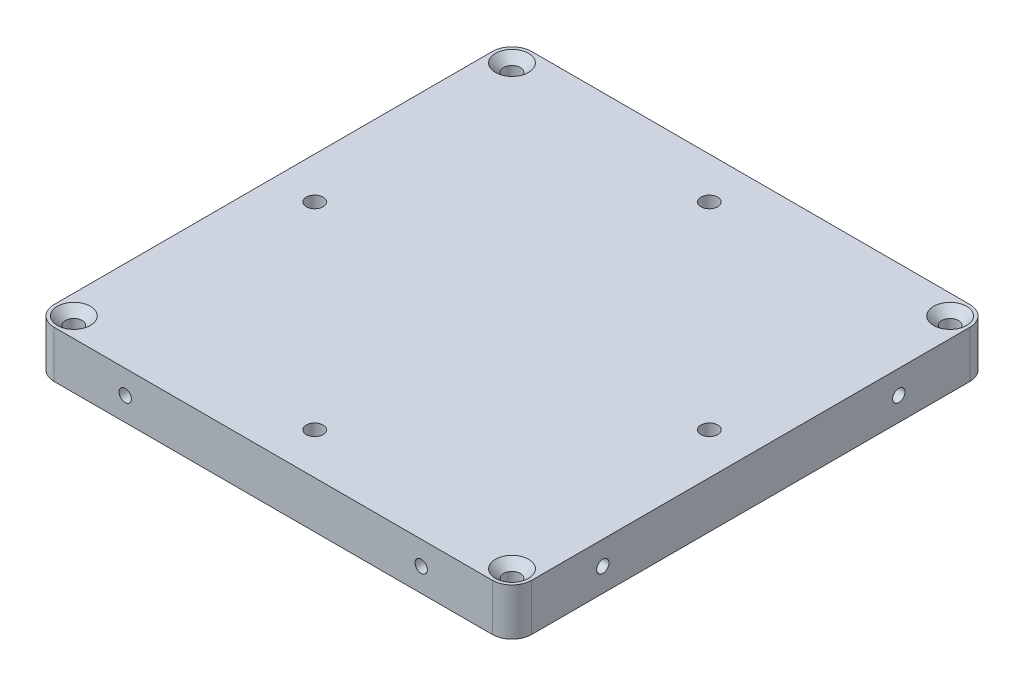
ISO-10303-21;
HEADER;
FILE_DESCRIPTION(('STEP AP214'),'2;1');
FILE_NAME('part.step','',(''),(''),'','','');
FILE_SCHEMA(('AUTOMOTIVE_DESIGN { 1 0 10303 214 1 1 1 1 }'));
ENDSEC;
DATA;
#1=APPLICATION_CONTEXT('core data for automotive mechanical design processes');
#2=APPLICATION_PROTOCOL_DEFINITION('international standard','automotive_design',2000,#1);
#3=PRODUCT_CONTEXT('',#1,'mechanical');
#4=PRODUCT('Part','Part','',(#3));
#5=PRODUCT_RELATED_PRODUCT_CATEGORY('part','',(#4));
#6=PRODUCT_DEFINITION_FORMATION('','',#4);
#7=PRODUCT_DEFINITION_CONTEXT('part definition',#1,'design');
#8=PRODUCT_DEFINITION('design','',#6,#7);
#9=PRODUCT_DEFINITION_SHAPE('','',#8);
#10=(LENGTH_UNIT() NAMED_UNIT(*) SI_UNIT(.MILLI.,.METRE.));
#11=(NAMED_UNIT(*) PLANE_ANGLE_UNIT() SI_UNIT($,.RADIAN.));
#12=(NAMED_UNIT(*) SI_UNIT($,.STERADIAN.) SOLID_ANGLE_UNIT());
#13=UNCERTAINTY_MEASURE_WITH_UNIT(LENGTH_MEASURE(1.E-05),#10,'distance_accuracy_value','');
#14=(GEOMETRIC_REPRESENTATION_CONTEXT(3) GLOBAL_UNCERTAINTY_ASSIGNED_CONTEXT((#13)) GLOBAL_UNIT_ASSIGNED_CONTEXT((#10,
#11,#12)) REPRESENTATION_CONTEXT('',''));
#15=CARTESIAN_POINT('',(0.,0.,0.));
#16=DIRECTION('',(0.,0.,1.));
#17=DIRECTION('',(1.,0.,0.));
#18=AXIS2_PLACEMENT_3D('',#15,#16,#17);
#19=CARTESIAN_POINT('',(-48.4125,4.7625,48.4125));
#20=DIRECTION('',(1.,0.,0.));
#21=DIRECTION('',(0.,0.,-1.));
#22=AXIS2_PLACEMENT_3D('',#19,#20,#21);
#23=PLANE('',#22);
#24=CARTESIAN_POINT('',(-48.4125,0.,-30.));
#25=DIRECTION('',(-1.,0.,0.));
#26=DIRECTION('',(0.,0.,1.));
#27=AXIS2_PLACEMENT_3D('',#24,#25,#26);
#28=CIRCLE('',#27,1.24999999999999);
#29=CARTESIAN_POINT('',(-48.4125,0.,-28.75));
#30=VERTEX_POINT('',#29);
#31=EDGE_CURVE('E177',#30,#30,#28,.T.);
#32=ORIENTED_EDGE('',*,*,#31,.F.);
#33=EDGE_LOOP('',(#32));
#34=FACE_BOUND('',#33,.T.);
#35=CARTESIAN_POINT('',(-48.4125,0.,30.));
#36=DIRECTION('',(-1.,0.,0.));
#37=DIRECTION('',(0.,0.,1.));
#38=AXIS2_PLACEMENT_3D('',#35,#36,#37);
#39=CIRCLE('',#38,1.24999999999999);
#40=CARTESIAN_POINT('',(-48.4125,0.,31.25));
#41=VERTEX_POINT('',#40);
#42=EDGE_CURVE('E185',#41,#41,#39,.T.);
#43=ORIENTED_EDGE('',*,*,#42,.F.);
#44=EDGE_LOOP('',(#43));
#45=FACE_BOUND('',#44,.T.);
#46=DIRECTION('',(0.,0.,1.));
#47=VECTOR('',#46,1.);
#48=CARTESIAN_POINT('',(-48.4125,4.7625,48.4125));
#49=LINE('',#48,#47);
#50=CARTESIAN_POINT('',(-48.4125,4.7625,-44.4125));
#51=VERTEX_POINT('',#50);
#52=CARTESIAN_POINT('',(-48.4125,4.7625,44.4125));
#53=VERTEX_POINT('',#52);
#54=EDGE_CURVE('E293',#51,#53,#49,.T.);
#55=ORIENTED_EDGE('',*,*,#54,.F.);
#56=DIRECTION('',(0.,-1.,0.));
#57=VECTOR('',#56,1.);
#58=CARTESIAN_POINT('',(-48.4125,4.7625,-44.4125));
#59=LINE('',#58,#57);
#60=CARTESIAN_POINT('',(-48.4125,-4.7625,-44.4125));
#61=VERTEX_POINT('',#60);
#62=EDGE_CURVE('E324',#51,#61,#59,.T.);
#63=ORIENTED_EDGE('',*,*,#62,.T.);
#64=DIRECTION('',(0.,0.,1.));
#65=VECTOR('',#64,1.);
#66=CARTESIAN_POINT('',(-48.4125,-4.7625,48.4125));
#67=LINE('',#66,#65);
#68=CARTESIAN_POINT('',(-48.4125,-4.7625,44.4125));
#69=VERTEX_POINT('',#68);
#70=EDGE_CURVE('E292',#61,#69,#67,.T.);
#71=ORIENTED_EDGE('',*,*,#70,.T.);
#72=DIRECTION('',(0.,-1.,0.));
#73=VECTOR('',#72,1.);
#74=CARTESIAN_POINT('',(-48.4125,4.7625,44.4125));
#75=LINE('',#74,#73);
#76=EDGE_CURVE('E308',#69,#53,#75,.F.);
#77=ORIENTED_EDGE('',*,*,#76,.T.);
#78=EDGE_LOOP('',(#55,#63,#71,#77));
#79=FACE_BOUND('',#78,.T.);
#80=ADVANCED_FACE('F45',(#34,#45,#79),#23,.F.);
#81=CARTESIAN_POINT('',(48.4125,4.7625,48.4125));
#82=DIRECTION('',(0.,0.,-1.));
#83=DIRECTION('',(-1.,0.,0.));
#84=AXIS2_PLACEMENT_3D('',#81,#82,#83);
#85=PLANE('',#84);
#86=CARTESIAN_POINT('',(-30.,0.,48.4125));
#87=DIRECTION('',(0.,0.,1.));
#88=DIRECTION('',(1.,0.,0.));
#89=AXIS2_PLACEMENT_3D('',#86,#87,#88);
#90=CIRCLE('',#89,1.24999999999999);
#91=CARTESIAN_POINT('',(-28.75,0.,48.4125));
#92=VERTEX_POINT('',#91);
#93=EDGE_CURVE('E193',#92,#92,#90,.T.);
#94=ORIENTED_EDGE('',*,*,#93,.F.);
#95=EDGE_LOOP('',(#94));
#96=FACE_BOUND('',#95,.T.);
#97=CARTESIAN_POINT('',(30.,0.,48.4125));
#98=DIRECTION('',(0.,0.,1.));
#99=DIRECTION('',(1.,0.,0.));
#100=AXIS2_PLACEMENT_3D('',#97,#98,#99);
#101=CIRCLE('',#100,1.24999999999999);
#102=CARTESIAN_POINT('',(31.25,0.,48.4125));
#103=VERTEX_POINT('',#102);
#104=EDGE_CURVE('E201',#103,#103,#101,.T.);
#105=ORIENTED_EDGE('',*,*,#104,.F.);
#106=EDGE_LOOP('',(#105));
#107=FACE_BOUND('',#106,.T.);
#108=DIRECTION('',(1.,0.,0.));
#109=VECTOR('',#108,1.);
#110=CARTESIAN_POINT('',(48.4125,-4.7625,48.4125));
#111=LINE('',#110,#109);
#112=CARTESIAN_POINT('',(-44.4125,-4.7625,48.4125));
#113=VERTEX_POINT('',#112);
#114=CARTESIAN_POINT('',(44.4125,-4.7625,48.4125));
#115=VERTEX_POINT('',#114);
#116=EDGE_CURVE('E312',#113,#115,#111,.T.);
#117=ORIENTED_EDGE('',*,*,#116,.T.);
#118=DIRECTION('',(0.,-1.,0.));
#119=VECTOR('',#118,1.);
#120=CARTESIAN_POINT('',(44.4125,4.7625,48.4125));
#121=LINE('',#120,#119);
#122=CARTESIAN_POINT('',(44.4125,4.7625,48.4125));
#123=VERTEX_POINT('',#122);
#124=EDGE_CURVE('E11',#115,#123,#121,.F.);
#125=ORIENTED_EDGE('',*,*,#124,.T.);
#126=DIRECTION('',(1.,0.,0.));
#127=VECTOR('',#126,1.);
#128=CARTESIAN_POINT('',(48.4125,4.7625,48.4125));
#129=LINE('',#128,#127);
#130=CARTESIAN_POINT('',(-44.4125,4.7625,48.4125));
#131=VERTEX_POINT('',#130);
#132=EDGE_CURVE('E297',#131,#123,#129,.T.);
#133=ORIENTED_EDGE('',*,*,#132,.F.);
#134=DIRECTION('',(0.,-1.,0.));
#135=VECTOR('',#134,1.);
#136=CARTESIAN_POINT('',(-44.4125,4.7625,48.4125));
#137=LINE('',#136,#135);
#138=EDGE_CURVE('E55',#131,#113,#137,.T.);
#139=ORIENTED_EDGE('',*,*,#138,.T.);
#140=EDGE_LOOP('',(#117,#125,#133,#139));
#141=FACE_BOUND('',#140,.T.);
#142=ADVANCED_FACE('F396',(#96,#107,#141),#85,.F.);
#143=CARTESIAN_POINT('',(48.4125,4.7625,48.4125));
#144=DIRECTION('',(-1.,0.,0.));
#145=DIRECTION('',(0.,0.,1.));
#146=AXIS2_PLACEMENT_3D('',#143,#144,#145);
#147=PLANE('',#146);
#148=CARTESIAN_POINT('',(48.4125,0.,30.));
#149=DIRECTION('',(1.,0.,0.));
#150=DIRECTION('',(0.,0.,-1.));
#151=AXIS2_PLACEMENT_3D('',#148,#149,#150);
#152=CIRCLE('',#151,1.24999999999999);
#153=CARTESIAN_POINT('',(48.4125,0.,28.75));
#154=VERTEX_POINT('',#153);
#155=EDGE_CURVE('E148',#154,#154,#152,.T.);
#156=ORIENTED_EDGE('',*,*,#155,.F.);
#157=EDGE_LOOP('',(#156));
#158=FACE_BOUND('',#157,.T.);
#159=CARTESIAN_POINT('',(48.4125,0.,-30.));
#160=DIRECTION('',(1.,0.,0.));
#161=DIRECTION('',(0.,0.,-1.));
#162=AXIS2_PLACEMENT_3D('',#159,#160,#161);
#163=CIRCLE('',#162,1.24999999999999);
#164=CARTESIAN_POINT('',(48.4125,0.,-31.25));
#165=VERTEX_POINT('',#164);
#166=EDGE_CURVE('E147',#165,#165,#163,.T.);
#167=ORIENTED_EDGE('',*,*,#166,.F.);
#168=EDGE_LOOP('',(#167));
#169=FACE_BOUND('',#168,.T.);
#170=DIRECTION('',(0.,0.,-1.));
#171=VECTOR('',#170,1.);
#172=CARTESIAN_POINT('',(48.4125,-4.7625,48.4125));
#173=LINE('',#172,#171);
#174=CARTESIAN_POINT('',(48.4125,-4.7625,44.4125));
#175=VERTEX_POINT('',#174);
#176=CARTESIAN_POINT('',(48.4125,-4.7625,-44.4125));
#177=VERTEX_POINT('',#176);
#178=EDGE_CURVE('E316',#175,#177,#173,.T.);
#179=ORIENTED_EDGE('',*,*,#178,.T.);
#180=DIRECTION('',(0.,-1.,0.));
#181=VECTOR('',#180,1.);
#182=CARTESIAN_POINT('',(48.4125,4.7625,-44.4125));
#183=LINE('',#182,#181);
#184=CARTESIAN_POINT('',(48.4125,4.7625,-44.4125));
#185=VERTEX_POINT('',#184);
#186=EDGE_CURVE('E63',#177,#185,#183,.F.);
#187=ORIENTED_EDGE('',*,*,#186,.T.);
#188=DIRECTION('',(0.,0.,-1.));
#189=VECTOR('',#188,1.);
#190=CARTESIAN_POINT('',(48.4125,4.7625,48.4125));
#191=LINE('',#190,#189);
#192=CARTESIAN_POINT('',(48.4125,4.7625,44.4125));
#193=VERTEX_POINT('',#192);
#194=EDGE_CURVE('E301',#193,#185,#191,.T.);
#195=ORIENTED_EDGE('',*,*,#194,.F.);
#196=DIRECTION('',(0.,-1.,0.));
#197=VECTOR('',#196,1.);
#198=CARTESIAN_POINT('',(48.4125,4.7625,44.4125));
#199=LINE('',#198,#197);
#200=EDGE_CURVE('E358',#193,#175,#199,.T.);
#201=ORIENTED_EDGE('',*,*,#200,.T.);
#202=EDGE_LOOP('',(#179,#187,#195,#201));
#203=FACE_BOUND('',#202,.T.);
#204=ADVANCED_FACE('F404',(#158,#169,#203),#147,.F.);
#205=CARTESIAN_POINT('',(48.4125,4.7625,-48.4125));
#206=DIRECTION('',(0.,0.,1.));
#207=DIRECTION('',(1.,0.,0.));
#208=AXIS2_PLACEMENT_3D('',#205,#206,#207);
#209=PLANE('',#208);
#210=CARTESIAN_POINT('',(30.,0.,-48.4125));
#211=DIRECTION('',(0.,0.,-1.));
#212=DIRECTION('',(-1.,0.,0.));
#213=AXIS2_PLACEMENT_3D('',#210,#211,#212);
#214=CIRCLE('',#213,1.24999999999999);
#215=CARTESIAN_POINT('',(28.75,0.,-48.4125));
#216=VERTEX_POINT('',#215);
#217=EDGE_CURVE('E161',#216,#216,#214,.T.);
#218=ORIENTED_EDGE('',*,*,#217,.F.);
#219=EDGE_LOOP('',(#218));
#220=FACE_BOUND('',#219,.T.);
#221=CARTESIAN_POINT('',(-30.,0.,-48.4125));
#222=DIRECTION('',(0.,0.,-1.));
#223=DIRECTION('',(-1.,0.,0.));
#224=AXIS2_PLACEMENT_3D('',#221,#222,#223);
#225=CIRCLE('',#224,1.24999999999999);
#226=CARTESIAN_POINT('',(-31.25,0.,-48.4125));
#227=VERTEX_POINT('',#226);
#228=EDGE_CURVE('E169',#227,#227,#225,.T.);
#229=ORIENTED_EDGE('',*,*,#228,.F.);
#230=EDGE_LOOP('',(#229));
#231=FACE_BOUND('',#230,.T.);
#232=DIRECTION('',(-1.,0.,0.));
#233=VECTOR('',#232,1.);
#234=CARTESIAN_POINT('',(48.4125,-4.7625,-48.4125));
#235=LINE('',#234,#233);
#236=CARTESIAN_POINT('',(44.4125,-4.7625,-48.4125));
#237=VERTEX_POINT('',#236);
#238=CARTESIAN_POINT('',(-44.4125,-4.7625,-48.4125));
#239=VERTEX_POINT('',#238);
#240=EDGE_CURVE('E298',#237,#239,#235,.T.);
#241=ORIENTED_EDGE('',*,*,#240,.T.);
#242=DIRECTION('',(0.,-1.,0.));
#243=VECTOR('',#242,1.);
#244=CARTESIAN_POINT('',(-44.4125,4.7625,-48.4125));
#245=LINE('',#244,#243);
#246=CARTESIAN_POINT('',(-44.4125,4.7625,-48.4125));
#247=VERTEX_POINT('',#246);
#248=EDGE_CURVE('E344',#239,#247,#245,.F.);
#249=ORIENTED_EDGE('',*,*,#248,.T.);
#250=DIRECTION('',(-1.,0.,0.));
#251=VECTOR('',#250,1.);
#252=CARTESIAN_POINT('',(48.4125,4.7625,-48.4125));
#253=LINE('',#252,#251);
#254=CARTESIAN_POINT('',(44.4125,4.7625,-48.4125));
#255=VERTEX_POINT('',#254);
#256=EDGE_CURVE('E304',#255,#247,#253,.T.);
#257=ORIENTED_EDGE('',*,*,#256,.F.);
#258=DIRECTION('',(0.,-1.,0.));
#259=VECTOR('',#258,1.);
#260=CARTESIAN_POINT('',(44.4125,4.7625,-48.4125));
#261=LINE('',#260,#259);
#262=EDGE_CURVE('E340',#255,#237,#261,.T.);
#263=ORIENTED_EDGE('',*,*,#262,.T.);
#264=EDGE_LOOP('',(#241,#249,#257,#263));
#265=FACE_BOUND('',#264,.T.);
#266=ADVANCED_FACE('F437',(#220,#231,#265),#209,.F.);
#267=CARTESIAN_POINT('',(0.,4.7625,0.));
#268=DIRECTION('',(0.,1.,0.));
#269=DIRECTION('',(0.,0.,1.));
#270=AXIS2_PLACEMENT_3D('',#267,#268,#269);
#271=PLANE('',#270);
#272=CARTESIAN_POINT('',(-44.4125,4.7625,-44.4125));
#273=DIRECTION('',(0.,1.,0.));
#274=DIRECTION('',(0.,0.,1.));
#275=AXIS2_PLACEMENT_3D('',#272,#273,#274);
#276=CIRCLE('',#275,3.36);
#277=CARTESIAN_POINT('',(-44.4125,4.7625,-41.0525));
#278=VERTEX_POINT('',#277);
#279=EDGE_CURVE('E209',#278,#278,#276,.T.);
#280=ORIENTED_EDGE('',*,*,#279,.F.);
#281=EDGE_LOOP('',(#280));
#282=FACE_BOUND('',#281,.T.);
#283=CARTESIAN_POINT('',(44.4125,4.7625,-44.4125));
#284=DIRECTION('',(0.,1.,0.));
#285=DIRECTION('',(0.,0.,1.));
#286=AXIS2_PLACEMENT_3D('',#283,#284,#285);
#287=CIRCLE('',#286,3.36);
#288=CARTESIAN_POINT('',(44.4125,4.7625,-41.0525));
#289=VERTEX_POINT('',#288);
#290=EDGE_CURVE('E217',#289,#289,#287,.T.);
#291=ORIENTED_EDGE('',*,*,#290,.F.);
#292=EDGE_LOOP('',(#291));
#293=FACE_BOUND('',#292,.T.);
#294=CARTESIAN_POINT('',(44.4125,4.7625,44.4125));
#295=DIRECTION('',(0.,1.,0.));
#296=DIRECTION('',(0.,0.,1.));
#297=AXIS2_PLACEMENT_3D('',#294,#295,#296);
#298=CIRCLE('',#297,3.36);
#299=CARTESIAN_POINT('',(44.4125,4.7625,47.7725));
#300=VERTEX_POINT('',#299);
#301=EDGE_CURVE('E226',#300,#300,#298,.T.);
#302=ORIENTED_EDGE('',*,*,#301,.F.);
#303=EDGE_LOOP('',(#302));
#304=FACE_BOUND('',#303,.T.);
#305=CARTESIAN_POINT('',(-44.4125,4.7625,44.4125));
#306=DIRECTION('',(0.,1.,0.));
#307=DIRECTION('',(0.,0.,1.));
#308=AXIS2_PLACEMENT_3D('',#305,#306,#307);
#309=CIRCLE('',#308,3.36);
#310=CARTESIAN_POINT('',(-44.4125,4.7625,47.7725));
#311=VERTEX_POINT('',#310);
#312=EDGE_CURVE('E235',#311,#311,#309,.T.);
#313=ORIENTED_EDGE('',*,*,#312,.F.);
#314=EDGE_LOOP('',(#313));
#315=FACE_BOUND('',#314,.T.);
#316=CARTESIAN_POINT('',(-40.,4.7625,0.));
#317=DIRECTION('',(0.,-1.,0.));
#318=DIRECTION('',(0.,0.,-1.));
#319=AXIS2_PLACEMENT_3D('',#316,#317,#318);
#320=CIRCLE('',#319,1.7);
#321=CARTESIAN_POINT('',(-40.,4.7625,-1.7));
#322=VERTEX_POINT('',#321);
#323=EDGE_CURVE('E252',#322,#322,#320,.T.);
#324=ORIENTED_EDGE('',*,*,#323,.T.);
#325=EDGE_LOOP('',(#324));
#326=FACE_BOUND('',#325,.T.);
#327=CARTESIAN_POINT('',(0.,4.7625,-40.));
#328=DIRECTION('',(0.,-1.,0.));
#329=DIRECTION('',(0.,0.,-1.));
#330=AXIS2_PLACEMENT_3D('',#327,#328,#329);
#331=CIRCLE('',#330,1.7);
#332=CARTESIAN_POINT('',(0.,4.7625,-41.7));
#333=VERTEX_POINT('',#332);
#334=EDGE_CURVE('E264',#333,#333,#331,.T.);
#335=ORIENTED_EDGE('',*,*,#334,.T.);
#336=EDGE_LOOP('',(#335));
#337=FACE_BOUND('',#336,.T.);
#338=CARTESIAN_POINT('',(40.,4.7625,0.));
#339=DIRECTION('',(0.,-1.,0.));
#340=DIRECTION('',(0.,0.,-1.));
#341=AXIS2_PLACEMENT_3D('',#338,#339,#340);
#342=CIRCLE('',#341,1.7);
#343=CARTESIAN_POINT('',(40.,4.7625,-1.7));
#344=VERTEX_POINT('',#343);
#345=EDGE_CURVE('E276',#344,#344,#342,.T.);
#346=ORIENTED_EDGE('',*,*,#345,.T.);
#347=EDGE_LOOP('',(#346));
#348=FACE_BOUND('',#347,.T.);
#349=CARTESIAN_POINT('',(0.,4.7625,40.));
#350=DIRECTION('',(0.,-1.,0.));
#351=DIRECTION('',(0.,0.,-1.));
#352=AXIS2_PLACEMENT_3D('',#349,#350,#351);
#353=CIRCLE('',#352,1.7);
#354=CARTESIAN_POINT('',(0.,4.7625,38.3));
#355=VERTEX_POINT('',#354);
#356=EDGE_CURVE('E288',#355,#355,#353,.T.);
#357=ORIENTED_EDGE('',*,*,#356,.T.);
#358=EDGE_LOOP('',(#357));
#359=FACE_BOUND('',#358,.T.);
#360=ORIENTED_EDGE('',*,*,#256,.T.);
#361=CARTESIAN_POINT('',(-44.4125,4.7625,-44.4125));
#362=DIRECTION('',(0.,1.,0.));
#363=DIRECTION('',(0.,0.,1.));
#364=AXIS2_PLACEMENT_3D('',#361,#362,#363);
#365=CIRCLE('',#364,4.);
#366=EDGE_CURVE('E355',#247,#51,#365,.T.);
#367=ORIENTED_EDGE('',*,*,#366,.T.);
#368=ORIENTED_EDGE('',*,*,#54,.T.);
#369=CARTESIAN_POINT('',(-44.4125,4.7625,44.4125));
#370=DIRECTION('',(0.,1.,0.));
#371=DIRECTION('',(0.,0.,1.));
#372=AXIS2_PLACEMENT_3D('',#369,#370,#371);
#373=CIRCLE('',#372,4.);
#374=EDGE_CURVE('E347',#53,#131,#373,.T.);
#375=ORIENTED_EDGE('',*,*,#374,.T.);
#376=ORIENTED_EDGE('',*,*,#132,.T.);
#377=CARTESIAN_POINT('',(44.4125,4.7625,44.4125));
#378=DIRECTION('',(0.,1.,0.));
#379=DIRECTION('',(0.,0.,1.));
#380=AXIS2_PLACEMENT_3D('',#377,#378,#379);
#381=CIRCLE('',#380,4.);
#382=EDGE_CURVE('E70',#123,#193,#381,.T.);
#383=ORIENTED_EDGE('',*,*,#382,.T.);
#384=ORIENTED_EDGE('',*,*,#194,.T.);
#385=CARTESIAN_POINT('',(44.4125,4.7625,-44.4125));
#386=DIRECTION('',(0.,1.,0.));
#387=DIRECTION('',(0.,0.,1.));
#388=AXIS2_PLACEMENT_3D('',#385,#386,#387);
#389=CIRCLE('',#388,4.);
#390=EDGE_CURVE('E352',#185,#255,#389,.T.);
#391=ORIENTED_EDGE('',*,*,#390,.T.);
#392=EDGE_LOOP('',(#360,#367,#368,#375,#376,#383,#384,#391));
#393=FACE_BOUND('',#392,.T.);
#394=ADVANCED_FACE('F440',(#282,#293,#304,#315,#326,#337,#348,#359,#393),#271,.T.);
#395=CARTESIAN_POINT('',(0.,-4.7625,0.));
#396=DIRECTION('',(0.,1.,0.));
#397=DIRECTION('',(0.,0.,1.));
#398=AXIS2_PLACEMENT_3D('',#395,#396,#397);
#399=PLANE('',#398);
#400=CARTESIAN_POINT('',(-44.4125,-4.7625,-44.4125));
#401=DIRECTION('',(0.,1.,0.));
#402=DIRECTION('',(0.,0.,1.));
#403=AXIS2_PLACEMENT_3D('',#400,#401,#402);
#404=CIRCLE('',#403,1.69999999999999);
#405=CARTESIAN_POINT('',(-44.4125,-4.7625,-42.7125));
#406=VERTEX_POINT('',#405);
#407=EDGE_CURVE('E49',#406,#406,#404,.T.);
#408=ORIENTED_EDGE('',*,*,#407,.T.);
#409=EDGE_LOOP('',(#408));
#410=FACE_BOUND('',#409,.T.);
#411=CARTESIAN_POINT('',(44.4125,-4.7625,-44.4125));
#412=DIRECTION('',(0.,1.,0.));
#413=DIRECTION('',(0.,0.,1.));
#414=AXIS2_PLACEMENT_3D('',#411,#412,#413);
#415=CIRCLE('',#414,1.69999999999999);
#416=CARTESIAN_POINT('',(44.4125,-4.7625,-42.7125));
#417=VERTEX_POINT('',#416);
#418=EDGE_CURVE('E225',#417,#417,#415,.T.);
#419=ORIENTED_EDGE('',*,*,#418,.T.);
#420=EDGE_LOOP('',(#419));
#421=FACE_BOUND('',#420,.T.);
#422=CARTESIAN_POINT('',(44.4125,-4.7625,44.4125));
#423=DIRECTION('',(0.,1.,0.));
#424=DIRECTION('',(0.,0.,1.));
#425=AXIS2_PLACEMENT_3D('',#422,#423,#424);
#426=CIRCLE('',#425,1.69999999999999);
#427=CARTESIAN_POINT('',(44.4125,-4.7625,46.1125));
#428=VERTEX_POINT('',#427);
#429=EDGE_CURVE('E234',#428,#428,#426,.T.);
#430=ORIENTED_EDGE('',*,*,#429,.T.);
#431=EDGE_LOOP('',(#430));
#432=FACE_BOUND('',#431,.T.);
#433=CARTESIAN_POINT('',(-44.4125,-4.7625,44.4125));
#434=DIRECTION('',(0.,1.,0.));
#435=DIRECTION('',(0.,0.,1.));
#436=AXIS2_PLACEMENT_3D('',#433,#434,#435);
#437=CIRCLE('',#436,1.69999999999999);
#438=CARTESIAN_POINT('',(-44.4125,-4.7625,46.1125));
#439=VERTEX_POINT('',#438);
#440=EDGE_CURVE('E243',#439,#439,#437,.T.);
#441=ORIENTED_EDGE('',*,*,#440,.T.);
#442=EDGE_LOOP('',(#441));
#443=FACE_BOUND('',#442,.T.);
#444=CARTESIAN_POINT('',(-40.,-4.7625,0.));
#445=DIRECTION('',(0.,-1.,0.));
#446=DIRECTION('',(0.,0.,-1.));
#447=AXIS2_PLACEMENT_3D('',#444,#445,#446);
#448=CIRCLE('',#447,3.36);
#449=CARTESIAN_POINT('',(-40.,-4.7625,-3.36));
#450=VERTEX_POINT('',#449);
#451=EDGE_CURVE('E244',#450,#450,#448,.T.);
#452=ORIENTED_EDGE('',*,*,#451,.F.);
#453=EDGE_LOOP('',(#452));
#454=FACE_BOUND('',#453,.T.);
#455=CARTESIAN_POINT('',(0.,-4.7625,-40.));
#456=DIRECTION('',(0.,-1.,0.));
#457=DIRECTION('',(0.,0.,-1.));
#458=AXIS2_PLACEMENT_3D('',#455,#456,#457);
#459=CIRCLE('',#458,3.36);
#460=CARTESIAN_POINT('',(0.,-4.7625,-43.36));
#461=VERTEX_POINT('',#460);
#462=EDGE_CURVE('E256',#461,#461,#459,.T.);
#463=ORIENTED_EDGE('',*,*,#462,.F.);
#464=EDGE_LOOP('',(#463));
#465=FACE_BOUND('',#464,.T.);
#466=CARTESIAN_POINT('',(40.,-4.7625,0.));
#467=DIRECTION('',(0.,-1.,0.));
#468=DIRECTION('',(0.,0.,-1.));
#469=AXIS2_PLACEMENT_3D('',#466,#467,#468);
#470=CIRCLE('',#469,3.36);
#471=CARTESIAN_POINT('',(40.,-4.7625,-3.36));
#472=VERTEX_POINT('',#471);
#473=EDGE_CURVE('E268',#472,#472,#470,.T.);
#474=ORIENTED_EDGE('',*,*,#473,.F.);
#475=EDGE_LOOP('',(#474));
#476=FACE_BOUND('',#475,.T.);
#477=CARTESIAN_POINT('',(0.,-4.7625,40.));
#478=DIRECTION('',(0.,-1.,0.));
#479=DIRECTION('',(0.,0.,-1.));
#480=AXIS2_PLACEMENT_3D('',#477,#478,#479);
#481=CIRCLE('',#480,3.36);
#482=CARTESIAN_POINT('',(0.,-4.7625,36.64));
#483=VERTEX_POINT('',#482);
#484=EDGE_CURVE('E280',#483,#483,#481,.T.);
#485=ORIENTED_EDGE('',*,*,#484,.F.);
#486=EDGE_LOOP('',(#485));
#487=FACE_BOUND('',#486,.T.);
#488=ORIENTED_EDGE('',*,*,#70,.F.);
#489=CARTESIAN_POINT('',(-44.4125,-4.7625,-44.4125));
#490=DIRECTION('',(0.,1.,0.));
#491=DIRECTION('',(0.,0.,1.));
#492=AXIS2_PLACEMENT_3D('',#489,#490,#491);
#493=CIRCLE('',#492,4.);
#494=EDGE_CURVE('E337',#61,#239,#493,.F.);
#495=ORIENTED_EDGE('',*,*,#494,.T.);
#496=ORIENTED_EDGE('',*,*,#240,.F.);
#497=CARTESIAN_POINT('',(44.4125,-4.7625,-44.4125));
#498=DIRECTION('',(0.,1.,0.));
#499=DIRECTION('',(0.,0.,1.));
#500=AXIS2_PLACEMENT_3D('',#497,#498,#499);
#501=CIRCLE('',#500,4.);
#502=EDGE_CURVE('E334',#237,#177,#501,.F.);
#503=ORIENTED_EDGE('',*,*,#502,.T.);
#504=ORIENTED_EDGE('',*,*,#178,.F.);
#505=CARTESIAN_POINT('',(44.4125,-4.7625,44.4125));
#506=DIRECTION('',(0.,1.,0.));
#507=DIRECTION('',(0.,0.,1.));
#508=AXIS2_PLACEMENT_3D('',#505,#506,#507);
#509=CIRCLE('',#508,4.);
#510=EDGE_CURVE('E331',#175,#115,#509,.F.);
#511=ORIENTED_EDGE('',*,*,#510,.T.);
#512=ORIENTED_EDGE('',*,*,#116,.F.);
#513=CARTESIAN_POINT('',(-44.4125,-4.7625,44.4125));
#514=DIRECTION('',(0.,1.,0.));
#515=DIRECTION('',(0.,0.,1.));
#516=AXIS2_PLACEMENT_3D('',#513,#514,#515);
#517=CIRCLE('',#516,4.);
#518=EDGE_CURVE('E328',#113,#69,#517,.F.);
#519=ORIENTED_EDGE('',*,*,#518,.T.);
#520=EDGE_LOOP('',(#488,#495,#496,#503,#504,#511,#512,#519));
#521=FACE_BOUND('',#520,.T.);
#522=ADVANCED_FACE('F376',(#410,#421,#432,#443,#454,#465,#476,#487,#521),#399,.F.);
#523=CARTESIAN_POINT('',(-44.4125,4.7625,-44.4125));
#524=DIRECTION('',(0.,-1.,0.));
#525=DIRECTION('',(0.,0.,-1.));
#526=AXIS2_PLACEMENT_3D('',#523,#524,#525);
#527=CYLINDRICAL_SURFACE('',#526,4.);
#528=ORIENTED_EDGE('',*,*,#366,.F.);
#529=ORIENTED_EDGE('',*,*,#248,.F.);
#530=ORIENTED_EDGE('',*,*,#494,.F.);
#531=ORIENTED_EDGE('',*,*,#62,.F.);
#532=EDGE_LOOP('',(#528,#529,#530,#531));
#533=FACE_BOUND('',#532,.T.);
#534=ADVANCED_FACE('F411',(#533),#527,.T.);
#535=CARTESIAN_POINT('',(44.4125,4.7625,-44.4125));
#536=DIRECTION('',(0.,-1.,0.));
#537=DIRECTION('',(0.,0.,-1.));
#538=AXIS2_PLACEMENT_3D('',#535,#536,#537);
#539=CYLINDRICAL_SURFACE('',#538,4.);
#540=ORIENTED_EDGE('',*,*,#390,.F.);
#541=ORIENTED_EDGE('',*,*,#186,.F.);
#542=ORIENTED_EDGE('',*,*,#502,.F.);
#543=ORIENTED_EDGE('',*,*,#262,.F.);
#544=EDGE_LOOP('',(#540,#541,#542,#543));
#545=FACE_BOUND('',#544,.T.);
#546=ADVANCED_FACE('F414',(#545),#539,.T.);
#547=CARTESIAN_POINT('',(44.4125,4.7625,44.4125));
#548=DIRECTION('',(0.,-1.,0.));
#549=DIRECTION('',(0.,0.,-1.));
#550=AXIS2_PLACEMENT_3D('',#547,#548,#549);
#551=CYLINDRICAL_SURFACE('',#550,4.);
#552=ORIENTED_EDGE('',*,*,#382,.F.);
#553=ORIENTED_EDGE('',*,*,#124,.F.);
#554=ORIENTED_EDGE('',*,*,#510,.F.);
#555=ORIENTED_EDGE('',*,*,#200,.F.);
#556=EDGE_LOOP('',(#552,#553,#554,#555));
#557=FACE_BOUND('',#556,.T.);
#558=ADVANCED_FACE('F417',(#557),#551,.T.);
#559=CARTESIAN_POINT('',(-44.4125,4.7625,44.4125));
#560=DIRECTION('',(0.,-1.,0.));
#561=DIRECTION('',(0.,0.,-1.));
#562=AXIS2_PLACEMENT_3D('',#559,#560,#561);
#563=CYLINDRICAL_SURFACE('',#562,4.);
#564=ORIENTED_EDGE('',*,*,#374,.F.);
#565=ORIENTED_EDGE('',*,*,#76,.F.);
#566=ORIENTED_EDGE('',*,*,#518,.F.);
#567=ORIENTED_EDGE('',*,*,#138,.F.);
#568=EDGE_LOOP('',(#564,#565,#566,#567));
#569=FACE_BOUND('',#568,.T.);
#570=ADVANCED_FACE('F47',(#569),#563,.T.);
#571=CARTESIAN_POINT('',(0.,-4.7625,40.));
#572=DIRECTION('',(0.,-1.,0.));
#573=DIRECTION('',(0.,0.,-1.));
#574=AXIS2_PLACEMENT_3D('',#571,#572,#573);
#575=CYLINDRICAL_SURFACE('',#574,1.7);
#576=ORIENTED_EDGE('',*,*,#356,.F.);
#577=EDGE_LOOP('',(#576));
#578=FACE_BOUND('',#577,.T.);
#579=CARTESIAN_POINT('',(0.,-3.1025,40.));
#580=DIRECTION('',(0.,-1.,0.));
#581=DIRECTION('',(0.,0.,-1.));
#582=AXIS2_PLACEMENT_3D('',#579,#580,#581);
#583=CIRCLE('',#582,1.7);
#584=CARTESIAN_POINT('',(0.,-3.1025,38.3));
#585=VERTEX_POINT('',#584);
#586=EDGE_CURVE('E284',#585,#585,#583,.T.);
#587=ORIENTED_EDGE('',*,*,#586,.T.);
#588=EDGE_LOOP('',(#587));
#589=FACE_BOUND('',#588,.T.);
#590=ADVANCED_FACE('F424',(#578,#589),#575,.F.);
#591=CARTESIAN_POINT('',(0.,-4.7625,40.));
#592=DIRECTION('',(0.,-1.,0.));
#593=DIRECTION('',(0.,0.,-1.));
#594=AXIS2_PLACEMENT_3D('',#591,#592,#593);
#595=CONICAL_SURFACE('',#594,3.36,0.785398163397449);
#596=ORIENTED_EDGE('',*,*,#586,.F.);
#597=EDGE_LOOP('',(#596));
#598=FACE_BOUND('',#597,.T.);
#599=ORIENTED_EDGE('',*,*,#484,.T.);
#600=EDGE_LOOP('',(#599));
#601=FACE_BOUND('',#600,.T.);
#602=ADVANCED_FACE('F701',(#598,#601),#595,.F.);
#603=CARTESIAN_POINT('',(40.,-4.7625,0.));
#604=DIRECTION('',(0.,-1.,0.));
#605=DIRECTION('',(0.,0.,-1.));
#606=AXIS2_PLACEMENT_3D('',#603,#604,#605);
#607=CYLINDRICAL_SURFACE('',#606,1.7);
#608=ORIENTED_EDGE('',*,*,#345,.F.);
#609=EDGE_LOOP('',(#608));
#610=FACE_BOUND('',#609,.T.);
#611=CARTESIAN_POINT('',(40.,-3.1025,0.));
#612=DIRECTION('',(0.,-1.,0.));
#613=DIRECTION('',(0.,0.,-1.));
#614=AXIS2_PLACEMENT_3D('',#611,#612,#613);
#615=CIRCLE('',#614,1.7);
#616=CARTESIAN_POINT('',(40.,-3.1025,-1.7));
#617=VERTEX_POINT('',#616);
#618=EDGE_CURVE('E272',#617,#617,#615,.T.);
#619=ORIENTED_EDGE('',*,*,#618,.T.);
#620=EDGE_LOOP('',(#619));
#621=FACE_BOUND('',#620,.T.);
#622=ADVANCED_FACE('F710',(#610,#621),#607,.F.);
#623=CARTESIAN_POINT('',(40.,-4.7625,0.));
#624=DIRECTION('',(0.,-1.,0.));
#625=DIRECTION('',(0.,0.,-1.));
#626=AXIS2_PLACEMENT_3D('',#623,#624,#625);
#627=CONICAL_SURFACE('',#626,3.36,0.785398163397449);
#628=ORIENTED_EDGE('',*,*,#618,.F.);
#629=EDGE_LOOP('',(#628));
#630=FACE_BOUND('',#629,.T.);
#631=ORIENTED_EDGE('',*,*,#473,.T.);
#632=EDGE_LOOP('',(#631));
#633=FACE_BOUND('',#632,.T.);
#634=ADVANCED_FACE('F719',(#630,#633),#627,.F.);
#635=CARTESIAN_POINT('',(0.,-4.7625,-40.));
#636=DIRECTION('',(0.,-1.,0.));
#637=DIRECTION('',(0.,0.,-1.));
#638=AXIS2_PLACEMENT_3D('',#635,#636,#637);
#639=CYLINDRICAL_SURFACE('',#638,1.7);
#640=ORIENTED_EDGE('',*,*,#334,.F.);
#641=EDGE_LOOP('',(#640));
#642=FACE_BOUND('',#641,.T.);
#643=CARTESIAN_POINT('',(0.,-3.1025,-40.));
#644=DIRECTION('',(0.,-1.,0.));
#645=DIRECTION('',(0.,0.,-1.));
#646=AXIS2_PLACEMENT_3D('',#643,#644,#645);
#647=CIRCLE('',#646,1.7);
#648=CARTESIAN_POINT('',(0.,-3.1025,-41.7));
#649=VERTEX_POINT('',#648);
#650=EDGE_CURVE('E260',#649,#649,#647,.T.);
#651=ORIENTED_EDGE('',*,*,#650,.T.);
#652=EDGE_LOOP('',(#651));
#653=FACE_BOUND('',#652,.T.);
#654=ADVANCED_FACE('F729',(#642,#653),#639,.F.);
#655=CARTESIAN_POINT('',(0.,-4.7625,-40.));
#656=DIRECTION('',(0.,-1.,0.));
#657=DIRECTION('',(0.,0.,-1.));
#658=AXIS2_PLACEMENT_3D('',#655,#656,#657);
#659=CONICAL_SURFACE('',#658,3.36,0.785398163397449);
#660=ORIENTED_EDGE('',*,*,#650,.F.);
#661=EDGE_LOOP('',(#660));
#662=FACE_BOUND('',#661,.T.);
#663=ORIENTED_EDGE('',*,*,#462,.T.);
#664=EDGE_LOOP('',(#663));
#665=FACE_BOUND('',#664,.T.);
#666=ADVANCED_FACE('F739',(#662,#665),#659,.F.);
#667=CARTESIAN_POINT('',(-40.,-4.7625,0.));
#668=DIRECTION('',(0.,-1.,0.));
#669=DIRECTION('',(0.,0.,-1.));
#670=AXIS2_PLACEMENT_3D('',#667,#668,#669);
#671=CYLINDRICAL_SURFACE('',#670,1.7);
#672=ORIENTED_EDGE('',*,*,#323,.F.);
#673=EDGE_LOOP('',(#672));
#674=FACE_BOUND('',#673,.T.);
#675=CARTESIAN_POINT('',(-40.,-3.1025,0.));
#676=DIRECTION('',(0.,-1.,0.));
#677=DIRECTION('',(0.,0.,-1.));
#678=AXIS2_PLACEMENT_3D('',#675,#676,#677);
#679=CIRCLE('',#678,1.7);
#680=CARTESIAN_POINT('',(-40.,-3.1025,-1.7));
#681=VERTEX_POINT('',#680);
#682=EDGE_CURVE('E248',#681,#681,#679,.T.);
#683=ORIENTED_EDGE('',*,*,#682,.T.);
#684=EDGE_LOOP('',(#683));
#685=FACE_BOUND('',#684,.T.);
#686=ADVANCED_FACE('F749',(#674,#685),#671,.F.);
#687=CARTESIAN_POINT('',(-40.,-4.7625,0.));
#688=DIRECTION('',(0.,-1.,0.));
#689=DIRECTION('',(0.,0.,-1.));
#690=AXIS2_PLACEMENT_3D('',#687,#688,#689);
#691=CONICAL_SURFACE('',#690,3.36,0.785398163397449);
#692=ORIENTED_EDGE('',*,*,#682,.F.);
#693=EDGE_LOOP('',(#692));
#694=FACE_BOUND('',#693,.T.);
#695=ORIENTED_EDGE('',*,*,#451,.T.);
#696=EDGE_LOOP('',(#695));
#697=FACE_BOUND('',#696,.T.);
#698=ADVANCED_FACE('F759',(#694,#697),#691,.F.);
#699=CARTESIAN_POINT('',(-44.4125,4.7625,44.4125));
#700=DIRECTION('',(0.,1.,0.));
#701=DIRECTION('',(0.,0.,1.));
#702=AXIS2_PLACEMENT_3D('',#699,#700,#701);
#703=CYLINDRICAL_SURFACE('',#702,1.69999999999999);
#704=CARTESIAN_POINT('',(-44.4125,3.10249999999999,44.4125));
#705=DIRECTION('',(0.,1.,0.));
#706=DIRECTION('',(0.,0.,1.));
#707=AXIS2_PLACEMENT_3D('',#704,#705,#706);
#708=CIRCLE('',#707,1.69999999999999);
#709=CARTESIAN_POINT('',(-44.4125,3.10249999999999,46.1125));
#710=VERTEX_POINT('',#709);
#711=EDGE_CURVE('E239',#710,#710,#708,.T.);
#712=ORIENTED_EDGE('',*,*,#711,.T.);
#713=EDGE_LOOP('',(#712));
#714=FACE_BOUND('',#713,.T.);
#715=ORIENTED_EDGE('',*,*,#440,.F.);
#716=EDGE_LOOP('',(#715));
#717=FACE_BOUND('',#716,.T.);
#718=ADVANCED_FACE('F768',(#714,#717),#703,.F.);
#719=CARTESIAN_POINT('',(-44.4125,4.7625,44.4125));
#720=DIRECTION('',(0.,1.,0.));
#721=DIRECTION('',(0.,0.,1.));
#722=AXIS2_PLACEMENT_3D('',#719,#720,#721);
#723=CONICAL_SURFACE('',#722,3.36,0.785398163397448);
#724=ORIENTED_EDGE('',*,*,#711,.F.);
#725=EDGE_LOOP('',(#724));
#726=FACE_BOUND('',#725,.T.);
#727=ORIENTED_EDGE('',*,*,#312,.T.);
#728=EDGE_LOOP('',(#727));
#729=FACE_BOUND('',#728,.T.);
#730=ADVANCED_FACE('F777',(#726,#729),#723,.F.);
#731=CARTESIAN_POINT('',(44.4125,4.7625,44.4125));
#732=DIRECTION('',(0.,1.,0.));
#733=DIRECTION('',(0.,0.,1.));
#734=AXIS2_PLACEMENT_3D('',#731,#732,#733);
#735=CYLINDRICAL_SURFACE('',#734,1.69999999999999);
#736=CARTESIAN_POINT('',(44.4125,3.10249999999999,44.4125));
#737=DIRECTION('',(0.,1.,0.));
#738=DIRECTION('',(0.,0.,1.));
#739=AXIS2_PLACEMENT_3D('',#736,#737,#738);
#740=CIRCLE('',#739,1.69999999999999);
#741=CARTESIAN_POINT('',(44.4125,3.10249999999999,46.1125));
#742=VERTEX_POINT('',#741);
#743=EDGE_CURVE('E230',#742,#742,#740,.T.);
#744=ORIENTED_EDGE('',*,*,#743,.T.);
#745=EDGE_LOOP('',(#744));
#746=FACE_BOUND('',#745,.T.);
#747=ORIENTED_EDGE('',*,*,#429,.F.);
#748=EDGE_LOOP('',(#747));
#749=FACE_BOUND('',#748,.T.);
#750=ADVANCED_FACE('F392',(#746,#749),#735,.F.);
#751=CARTESIAN_POINT('',(44.4125,4.7625,44.4125));
#752=DIRECTION('',(0.,1.,0.));
#753=DIRECTION('',(0.,0.,1.));
#754=AXIS2_PLACEMENT_3D('',#751,#752,#753);
#755=CONICAL_SURFACE('',#754,3.36,0.785398163397448);
#756=ORIENTED_EDGE('',*,*,#743,.F.);
#757=EDGE_LOOP('',(#756));
#758=FACE_BOUND('',#757,.T.);
#759=ORIENTED_EDGE('',*,*,#301,.T.);
#760=EDGE_LOOP('',(#759));
#761=FACE_BOUND('',#760,.T.);
#762=ADVANCED_FACE('F382',(#758,#761),#755,.F.);
#763=CARTESIAN_POINT('',(44.4125,4.7625,-44.4125));
#764=DIRECTION('',(0.,1.,0.));
#765=DIRECTION('',(0.,0.,1.));
#766=AXIS2_PLACEMENT_3D('',#763,#764,#765);
#767=CYLINDRICAL_SURFACE('',#766,1.69999999999999);
#768=CARTESIAN_POINT('',(44.4125,3.10249999999999,-44.4125));
#769=DIRECTION('',(0.,1.,0.));
#770=DIRECTION('',(0.,0.,1.));
#771=AXIS2_PLACEMENT_3D('',#768,#769,#770);
#772=CIRCLE('',#771,1.69999999999999);
#773=CARTESIAN_POINT('',(44.4125,3.10249999999999,-42.7125));
#774=VERTEX_POINT('',#773);
#775=EDGE_CURVE('E221',#774,#774,#772,.T.);
#776=ORIENTED_EDGE('',*,*,#775,.T.);
#777=EDGE_LOOP('',(#776));
#778=FACE_BOUND('',#777,.T.);
#779=ORIENTED_EDGE('',*,*,#418,.F.);
#780=EDGE_LOOP('',(#779));
#781=FACE_BOUND('',#780,.T.);
#782=ADVANCED_FACE('F379',(#778,#781),#767,.F.);
#783=CARTESIAN_POINT('',(44.4125,4.7625,-44.4125));
#784=DIRECTION('',(0.,1.,0.));
#785=DIRECTION('',(0.,0.,1.));
#786=AXIS2_PLACEMENT_3D('',#783,#784,#785);
#787=CONICAL_SURFACE('',#786,3.36,0.785398163397448);
#788=ORIENTED_EDGE('',*,*,#775,.F.);
#789=EDGE_LOOP('',(#788));
#790=FACE_BOUND('',#789,.T.);
#791=ORIENTED_EDGE('',*,*,#290,.T.);
#792=EDGE_LOOP('',(#791));
#793=FACE_BOUND('',#792,.T.);
#794=ADVANCED_FACE('F381',(#790,#793),#787,.F.);
#795=CARTESIAN_POINT('',(-44.4125,4.7625,-44.4125));
#796=DIRECTION('',(0.,1.,0.));
#797=DIRECTION('',(0.,0.,1.));
#798=AXIS2_PLACEMENT_3D('',#795,#796,#797);
#799=CYLINDRICAL_SURFACE('',#798,1.69999999999999);
#800=CARTESIAN_POINT('',(-44.4125,3.10249999999999,-44.4125));
#801=DIRECTION('',(0.,1.,0.));
#802=DIRECTION('',(0.,0.,1.));
#803=AXIS2_PLACEMENT_3D('',#800,#801,#802);
#804=CIRCLE('',#803,1.69999999999999);
#805=CARTESIAN_POINT('',(-44.4125,3.10249999999999,-42.7125));
#806=VERTEX_POINT('',#805);
#807=EDGE_CURVE('E213',#806,#806,#804,.T.);
#808=ORIENTED_EDGE('',*,*,#807,.T.);
#809=EDGE_LOOP('',(#808));
#810=FACE_BOUND('',#809,.T.);
#811=ORIENTED_EDGE('',*,*,#407,.F.);
#812=EDGE_LOOP('',(#811));
#813=FACE_BOUND('',#812,.T.);
#814=ADVANCED_FACE('F389',(#810,#813),#799,.F.);
#815=CARTESIAN_POINT('',(-44.4125,4.7625,-44.4125));
#816=DIRECTION('',(0.,1.,0.));
#817=DIRECTION('',(0.,0.,1.));
#818=AXIS2_PLACEMENT_3D('',#815,#816,#817);
#819=CONICAL_SURFACE('',#818,3.36,0.785398163397448);
#820=ORIENTED_EDGE('',*,*,#807,.F.);
#821=EDGE_LOOP('',(#820));
#822=FACE_BOUND('',#821,.T.);
#823=ORIENTED_EDGE('',*,*,#279,.T.);
#824=EDGE_LOOP('',(#823));
#825=FACE_BOUND('',#824,.T.);
#826=ADVANCED_FACE('F530',(#822,#825),#819,.F.);
#827=CARTESIAN_POINT('',(30.,0.,38.4125));
#828=DIRECTION('',(0.,0.,1.));
#829=DIRECTION('',(1.,0.,0.));
#830=AXIS2_PLACEMENT_3D('',#827,#828,#829);
#831=CONICAL_SURFACE('',#830,1.25,1.02974425867665);
#832=CARTESIAN_POINT('',(30.,0.,37.6614242262156));
#833=VERTEX_POINT('',#832);
#834=VERTEX_LOOP('',#833);
#835=FACE_BOUND('',#834,.T.);
#836=CARTESIAN_POINT('',(30.,0.,38.4125));
#837=DIRECTION('',(0.,0.,1.));
#838=DIRECTION('',(1.,0.,0.));
#839=AXIS2_PLACEMENT_3D('',#836,#837,#838);
#840=CIRCLE('',#839,1.25);
#841=CARTESIAN_POINT('',(31.25,0.,38.4125));
#842=VERTEX_POINT('',#841);
#843=EDGE_CURVE('E205',#842,#842,#840,.T.);
#844=ORIENTED_EDGE('',*,*,#843,.T.);
#845=EDGE_LOOP('',(#844));
#846=FACE_BOUND('',#845,.T.);
#847=ADVANCED_FACE('F526',(#835,#846),#831,.F.);
#848=CARTESIAN_POINT('',(30.,0.,48.4125));
#849=DIRECTION('',(0.,0.,1.));
#850=DIRECTION('',(1.,0.,0.));
#851=AXIS2_PLACEMENT_3D('',#848,#849,#850);
#852=CYLINDRICAL_SURFACE('',#851,1.24999999999999);
#853=ORIENTED_EDGE('',*,*,#843,.F.);
#854=EDGE_LOOP('',(#853));
#855=FACE_BOUND('',#854,.T.);
#856=ORIENTED_EDGE('',*,*,#104,.T.);
#857=EDGE_LOOP('',(#856));
#858=FACE_BOUND('',#857,.T.);
#859=ADVANCED_FACE('F522',(#855,#858),#852,.F.);
#860=CARTESIAN_POINT('',(-30.,0.,38.4125));
#861=DIRECTION('',(0.,0.,1.));
#862=DIRECTION('',(1.,0.,0.));
#863=AXIS2_PLACEMENT_3D('',#860,#861,#862);
#864=CONICAL_SURFACE('',#863,1.25,1.02974425867665);
#865=CARTESIAN_POINT('',(-30.,0.,37.6614242262156));
#866=VERTEX_POINT('',#865);
#867=VERTEX_LOOP('',#866);
#868=FACE_BOUND('',#867,.T.);
#869=CARTESIAN_POINT('',(-30.,0.,38.4125));
#870=DIRECTION('',(0.,0.,1.));
#871=DIRECTION('',(1.,0.,0.));
#872=AXIS2_PLACEMENT_3D('',#869,#870,#871);
#873=CIRCLE('',#872,1.25);
#874=CARTESIAN_POINT('',(-28.75,0.,38.4125));
#875=VERTEX_POINT('',#874);
#876=EDGE_CURVE('E197',#875,#875,#873,.T.);
#877=ORIENTED_EDGE('',*,*,#876,.T.);
#878=EDGE_LOOP('',(#877));
#879=FACE_BOUND('',#878,.T.);
#880=ADVANCED_FACE('F518',(#868,#879),#864,.F.);
#881=CARTESIAN_POINT('',(-30.,0.,48.4125));
#882=DIRECTION('',(0.,0.,1.));
#883=DIRECTION('',(1.,0.,0.));
#884=AXIS2_PLACEMENT_3D('',#881,#882,#883);
#885=CYLINDRICAL_SURFACE('',#884,1.24999999999999);
#886=ORIENTED_EDGE('',*,*,#876,.F.);
#887=EDGE_LOOP('',(#886));
#888=FACE_BOUND('',#887,.T.);
#889=ORIENTED_EDGE('',*,*,#93,.T.);
#890=EDGE_LOOP('',(#889));
#891=FACE_BOUND('',#890,.T.);
#892=ADVANCED_FACE('F515',(#888,#891),#885,.F.);
#893=CARTESIAN_POINT('',(-38.4125,0.,30.));
#894=DIRECTION('',(-1.,0.,0.));
#895=DIRECTION('',(0.,0.,1.));
#896=AXIS2_PLACEMENT_3D('',#893,#894,#895);
#897=CONICAL_SURFACE('',#896,1.25,1.02974425867665);
#898=CARTESIAN_POINT('',(-37.6614242262155,0.,30.));
#899=VERTEX_POINT('',#898);
#900=VERTEX_LOOP('',#899);
#901=FACE_BOUND('',#900,.T.);
#902=CARTESIAN_POINT('',(-38.4125,0.,30.));
#903=DIRECTION('',(-1.,0.,0.));
#904=DIRECTION('',(0.,0.,1.));
#905=AXIS2_PLACEMENT_3D('',#902,#903,#904);
#906=CIRCLE('',#905,1.25);
#907=CARTESIAN_POINT('',(-38.4125,0.,31.25));
#908=VERTEX_POINT('',#907);
#909=EDGE_CURVE('E189',#908,#908,#906,.T.);
#910=ORIENTED_EDGE('',*,*,#909,.T.);
#911=EDGE_LOOP('',(#910));
#912=FACE_BOUND('',#911,.T.);
#913=ADVANCED_FACE('F512',(#901,#912),#897,.F.);
#914=CARTESIAN_POINT('',(-48.4125,0.,30.));
#915=DIRECTION('',(-1.,0.,0.));
#916=DIRECTION('',(0.,0.,1.));
#917=AXIS2_PLACEMENT_3D('',#914,#915,#916);
#918=CYLINDRICAL_SURFACE('',#917,1.24999999999999);
#919=ORIENTED_EDGE('',*,*,#909,.F.);
#920=EDGE_LOOP('',(#919));
#921=FACE_BOUND('',#920,.T.);
#922=ORIENTED_EDGE('',*,*,#42,.T.);
#923=EDGE_LOOP('',(#922));
#924=FACE_BOUND('',#923,.T.);
#925=ADVANCED_FACE('F508',(#921,#924),#918,.F.);
#926=CARTESIAN_POINT('',(-38.4125,0.,-30.));
#927=DIRECTION('',(-1.,0.,0.));
#928=DIRECTION('',(0.,0.,1.));
#929=AXIS2_PLACEMENT_3D('',#926,#927,#928);
#930=CONICAL_SURFACE('',#929,1.25,1.02974425867665);
#931=CARTESIAN_POINT('',(-37.6614242262155,0.,-30.));
#932=VERTEX_POINT('',#931);
#933=VERTEX_LOOP('',#932);
#934=FACE_BOUND('',#933,.T.);
#935=CARTESIAN_POINT('',(-38.4125,0.,-30.));
#936=DIRECTION('',(-1.,0.,0.));
#937=DIRECTION('',(0.,0.,1.));
#938=AXIS2_PLACEMENT_3D('',#935,#936,#937);
#939=CIRCLE('',#938,1.25);
#940=CARTESIAN_POINT('',(-38.4125,0.,-28.75));
#941=VERTEX_POINT('',#940);
#942=EDGE_CURVE('E181',#941,#941,#939,.T.);
#943=ORIENTED_EDGE('',*,*,#942,.T.);
#944=EDGE_LOOP('',(#943));
#945=FACE_BOUND('',#944,.T.);
#946=ADVANCED_FACE('F504',(#934,#945),#930,.F.);
#947=CARTESIAN_POINT('',(-48.4125,0.,-30.));
#948=DIRECTION('',(-1.,0.,0.));
#949=DIRECTION('',(0.,0.,1.));
#950=AXIS2_PLACEMENT_3D('',#947,#948,#949);
#951=CYLINDRICAL_SURFACE('',#950,1.24999999999999);
#952=ORIENTED_EDGE('',*,*,#942,.F.);
#953=EDGE_LOOP('',(#952));
#954=FACE_BOUND('',#953,.T.);
#955=ORIENTED_EDGE('',*,*,#31,.T.);
#956=EDGE_LOOP('',(#955));
#957=FACE_BOUND('',#956,.T.);
#958=ADVANCED_FACE('F500',(#954,#957),#951,.F.);
#959=CARTESIAN_POINT('',(-30.,0.,-38.4125));
#960=DIRECTION('',(0.,0.,-1.));
#961=DIRECTION('',(-1.,0.,0.));
#962=AXIS2_PLACEMENT_3D('',#959,#960,#961);
#963=CONICAL_SURFACE('',#962,1.24999999999999,1.02974425867664);
#964=CARTESIAN_POINT('',(-30.,0.,-37.6614242262155));
#965=VERTEX_POINT('',#964);
#966=VERTEX_LOOP('',#965);
#967=FACE_BOUND('',#966,.T.);
#968=CARTESIAN_POINT('',(-30.,0.,-38.4125));
#969=DIRECTION('',(0.,0.,-1.));
#970=DIRECTION('',(-1.,0.,0.));
#971=AXIS2_PLACEMENT_3D('',#968,#969,#970);
#972=CIRCLE('',#971,1.24999999999999);
#973=CARTESIAN_POINT('',(-31.25,0.,-38.4125));
#974=VERTEX_POINT('',#973);
#975=EDGE_CURVE('E173',#974,#974,#972,.T.);
#976=ORIENTED_EDGE('',*,*,#975,.T.);
#977=EDGE_LOOP('',(#976));
#978=FACE_BOUND('',#977,.T.);
#979=ADVANCED_FACE('F496',(#967,#978),#963,.F.);
#980=CARTESIAN_POINT('',(-30.,0.,-48.4125));
#981=DIRECTION('',(0.,0.,-1.));
#982=DIRECTION('',(-1.,0.,0.));
#983=AXIS2_PLACEMENT_3D('',#980,#981,#982);
#984=CYLINDRICAL_SURFACE('',#983,1.24999999999999);
#985=ORIENTED_EDGE('',*,*,#975,.F.);
#986=EDGE_LOOP('',(#985));
#987=FACE_BOUND('',#986,.T.);
#988=ORIENTED_EDGE('',*,*,#228,.T.);
#989=EDGE_LOOP('',(#988));
#990=FACE_BOUND('',#989,.T.);
#991=ADVANCED_FACE('F492',(#987,#990),#984,.F.);
#992=CARTESIAN_POINT('',(30.,0.,-38.4125));
#993=DIRECTION('',(0.,0.,-1.));
#994=DIRECTION('',(-1.,0.,0.));
#995=AXIS2_PLACEMENT_3D('',#992,#993,#994);
#996=CONICAL_SURFACE('',#995,1.24999999999999,1.02974425867664);
#997=CARTESIAN_POINT('',(30.,0.,-37.6614242262156));
#998=VERTEX_POINT('',#997);
#999=VERTEX_LOOP('',#998);
#1000=FACE_BOUND('',#999,.T.);
#1001=CARTESIAN_POINT('',(30.,0.,-38.4125));
#1002=DIRECTION('',(0.,0.,-1.));
#1003=DIRECTION('',(-1.,0.,0.));
#1004=AXIS2_PLACEMENT_3D('',#1001,#1002,#1003);
#1005=CIRCLE('',#1004,1.24999999999999);
#1006=CARTESIAN_POINT('',(28.75,0.,-38.4125));
#1007=VERTEX_POINT('',#1006);
#1008=EDGE_CURVE('E165',#1007,#1007,#1005,.T.);
#1009=ORIENTED_EDGE('',*,*,#1008,.T.);
#1010=EDGE_LOOP('',(#1009));
#1011=FACE_BOUND('',#1010,.T.);
#1012=ADVANCED_FACE('F488',(#1000,#1011),#996,.F.);
#1013=CARTESIAN_POINT('',(30.,0.,-48.4125));
#1014=DIRECTION('',(0.,0.,-1.));
#1015=DIRECTION('',(-1.,0.,0.));
#1016=AXIS2_PLACEMENT_3D('',#1013,#1014,#1015);
#1017=CYLINDRICAL_SURFACE('',#1016,1.24999999999999);
#1018=ORIENTED_EDGE('',*,*,#1008,.F.);
#1019=EDGE_LOOP('',(#1018));
#1020=FACE_BOUND('',#1019,.T.);
#1021=ORIENTED_EDGE('',*,*,#217,.T.);
#1022=EDGE_LOOP('',(#1021));
#1023=FACE_BOUND('',#1022,.T.);
#1024=ADVANCED_FACE('F481',(#1020,#1023),#1017,.F.);
#1025=CARTESIAN_POINT('',(38.4125,0.,-30.));
#1026=DIRECTION('',(1.,0.,0.));
#1027=DIRECTION('',(0.,0.,-1.));
#1028=AXIS2_PLACEMENT_3D('',#1025,#1026,#1027);
#1029=CONICAL_SURFACE('',#1028,1.24999999999999,1.02974425867665);
#1030=CARTESIAN_POINT('',(37.6614242262156,0.,-30.));
#1031=VERTEX_POINT('',#1030);
#1032=VERTEX_LOOP('',#1031);
#1033=FACE_BOUND('',#1032,.T.);
#1034=CARTESIAN_POINT('',(38.4125,0.,-30.));
#1035=DIRECTION('',(1.,0.,0.));
#1036=DIRECTION('',(0.,0.,-1.));
#1037=AXIS2_PLACEMENT_3D('',#1034,#1035,#1036);
#1038=CIRCLE('',#1037,1.24999999999999);
#1039=CARTESIAN_POINT('',(38.4125,0.,-31.25));
#1040=VERTEX_POINT('',#1039);
#1041=EDGE_CURVE('E153',#1040,#1040,#1038,.T.);
#1042=ORIENTED_EDGE('',*,*,#1041,.T.);
#1043=EDGE_LOOP('',(#1042));
#1044=FACE_BOUND('',#1043,.T.);
#1045=ADVANCED_FACE('F476',(#1033,#1044),#1029,.F.);
#1046=CARTESIAN_POINT('',(48.4125,0.,-30.));
#1047=DIRECTION('',(1.,0.,0.));
#1048=DIRECTION('',(0.,0.,-1.));
#1049=AXIS2_PLACEMENT_3D('',#1046,#1047,#1048);
#1050=CYLINDRICAL_SURFACE('',#1049,1.24999999999999);
#1051=ORIENTED_EDGE('',*,*,#1041,.F.);
#1052=EDGE_LOOP('',(#1051));
#1053=FACE_BOUND('',#1052,.T.);
#1054=ORIENTED_EDGE('',*,*,#166,.T.);
#1055=EDGE_LOOP('',(#1054));
#1056=FACE_BOUND('',#1055,.T.);
#1057=ADVANCED_FACE('F140',(#1053,#1056),#1050,.F.);
#1058=CARTESIAN_POINT('',(38.4125,0.,30.));
#1059=DIRECTION('',(1.,0.,0.));
#1060=DIRECTION('',(0.,0.,-1.));
#1061=AXIS2_PLACEMENT_3D('',#1058,#1059,#1060);
#1062=CONICAL_SURFACE('',#1061,1.24999999999999,1.02974425867665);
#1063=CARTESIAN_POINT('',(37.6614242262156,0.,30.));
#1064=VERTEX_POINT('',#1063);
#1065=VERTEX_LOOP('',#1064);
#1066=FACE_BOUND('',#1065,.T.);
#1067=CARTESIAN_POINT('',(38.4125,0.,30.));
#1068=DIRECTION('',(1.,0.,0.));
#1069=DIRECTION('',(0.,0.,-1.));
#1070=AXIS2_PLACEMENT_3D('',#1067,#1068,#1069);
#1071=CIRCLE('',#1070,1.24999999999999);
#1072=CARTESIAN_POINT('',(38.4125,0.,28.75));
#1073=VERTEX_POINT('',#1072);
#1074=EDGE_CURVE('E144',#1073,#1073,#1071,.T.);
#1075=ORIENTED_EDGE('',*,*,#1074,.T.);
#1076=EDGE_LOOP('',(#1075));
#1077=FACE_BOUND('',#1076,.T.);
#1078=ADVANCED_FACE('F136',(#1066,#1077),#1062,.F.);
#1079=CARTESIAN_POINT('',(48.4125,0.,30.));
#1080=DIRECTION('',(1.,0.,0.));
#1081=DIRECTION('',(0.,0.,-1.));
#1082=AXIS2_PLACEMENT_3D('',#1079,#1080,#1081);
#1083=CYLINDRICAL_SURFACE('',#1082,1.24999999999999);
#1084=ORIENTED_EDGE('',*,*,#1074,.F.);
#1085=EDGE_LOOP('',(#1084));
#1086=FACE_BOUND('',#1085,.T.);
#1087=ORIENTED_EDGE('',*,*,#155,.T.);
#1088=EDGE_LOOP('',(#1087));
#1089=FACE_BOUND('',#1088,.T.);
#1090=ADVANCED_FACE('F139',(#1086,#1089),#1083,.F.);
#1091=CLOSED_SHELL('',(#80,#142,#204,#266,#394,#522,#534,#546,#558,#570,#590,#602,#622,#634,
#654,#666,#686,#698,#718,#730,#750,#762,#782,#794,#814,#826,#847,#859,#880,#892,#913,#925,#946,
#958,#979,#991,#1012,#1024,#1045,#1057,#1078,#1090));
#1092=MANIFOLD_SOLID_BREP('B2',#1091);
#1093=ADVANCED_BREP_SHAPE_REPRESENTATION('',(#18,#1092),#14);
#1094=SHAPE_DEFINITION_REPRESENTATION(#9,#1093);
ENDSEC;
END-ISO-10303-21;
